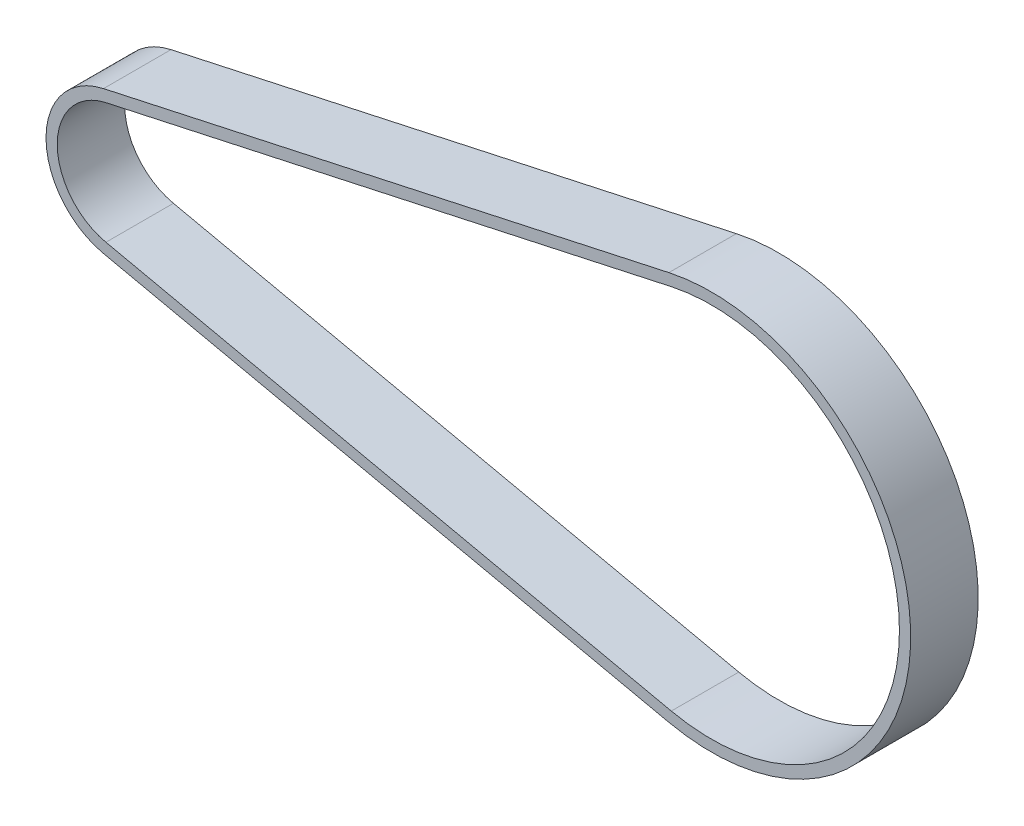
ISO-10303-21;
HEADER;
FILE_DESCRIPTION(('STEP AP214'),'2;1');
FILE_NAME('part.step','',(''),(''),'','','');
FILE_SCHEMA(('AUTOMOTIVE_DESIGN { 1 0 10303 214 1 1 1 1 }'));
ENDSEC;
DATA;
#1=APPLICATION_CONTEXT('core data for automotive mechanical design processes');
#2=APPLICATION_PROTOCOL_DEFINITION('international standard','automotive_design',2000,#1);
#3=PRODUCT_CONTEXT('',#1,'mechanical');
#4=PRODUCT('Part','Part','',(#3));
#5=PRODUCT_RELATED_PRODUCT_CATEGORY('part','',(#4));
#6=PRODUCT_DEFINITION_FORMATION('','',#4);
#7=PRODUCT_DEFINITION_CONTEXT('part definition',#1,'design');
#8=PRODUCT_DEFINITION('design','',#6,#7);
#9=PRODUCT_DEFINITION_SHAPE('','',#8);
#10=(LENGTH_UNIT() NAMED_UNIT(*) SI_UNIT(.MILLI.,.METRE.));
#11=(NAMED_UNIT(*) PLANE_ANGLE_UNIT() SI_UNIT($,.RADIAN.));
#12=(NAMED_UNIT(*) SI_UNIT($,.STERADIAN.) SOLID_ANGLE_UNIT());
#13=UNCERTAINTY_MEASURE_WITH_UNIT(LENGTH_MEASURE(1.E-05),#10,'distance_accuracy_value','');
#14=(GEOMETRIC_REPRESENTATION_CONTEXT(3) GLOBAL_UNCERTAINTY_ASSIGNED_CONTEXT((#13)) GLOBAL_UNIT_ASSIGNED_CONTEXT((#10,
#11,#12)) REPRESENTATION_CONTEXT('',''));
#15=CARTESIAN_POINT('',(0.,0.,0.));
#16=DIRECTION('',(0.,0.,1.));
#17=DIRECTION('',(1.,0.,0.));
#18=AXIS2_PLACEMENT_3D('',#15,#16,#17);
#19=CARTESIAN_POINT('',(0.,0.,6.));
#20=DIRECTION('',(0.,0.,1.));
#21=DIRECTION('',(1.,0.,0.));
#22=AXIS2_PLACEMENT_3D('',#19,#20,#21);
#23=PLANE('',#22);
#24=CARTESIAN_POINT('',(0.,0.,6.));
#25=DIRECTION('',(0.,0.,1.));
#26=DIRECTION('',(1.,0.,0.));
#27=AXIS2_PLACEMENT_3D('',#24,#25,#26);
#28=CIRCLE('',#27,6.5);
#29=CARTESIAN_POINT('',(-1.38518518518518,6.35068988400028,6.));
#30=VERTEX_POINT('',#29);
#31=CARTESIAN_POINT('',(-1.38518518518519,-6.35068988400028,6.));
#32=VERTEX_POINT('',#31);
#33=EDGE_CURVE('E153',#30,#32,#28,.T.);
#34=ORIENTED_EDGE('',*,*,#33,.T.);
#35=DIRECTION('',(0.97702921292312,-0.213105413105413,0.));
#36=VECTOR('',#35,1.);
#37=CARTESIAN_POINT('',(-1.38518518518519,-6.35068988400028,6.));
#38=LINE('',#37,#36);
#39=CARTESIAN_POINT('',(48.8737720797721,-17.3129576529977,6.));
#40=VERTEX_POINT('',#39);
#41=EDGE_CURVE('E157',#32,#40,#38,.T.);
#42=ORIENTED_EDGE('',*,*,#41,.T.);
#43=CARTESIAN_POINT('',(52.65,0.,6.));
#44=DIRECTION('',(0.,0.,1.));
#45=DIRECTION('',(1.,0.,0.));
#46=AXIS2_PLACEMENT_3D('',#43,#44,#45);
#47=CIRCLE('',#46,17.72);
#48=CARTESIAN_POINT('',(48.8737720797721,17.3129576529977,6.));
#49=VERTEX_POINT('',#48);
#50=EDGE_CURVE('E161',#40,#49,#47,.T.);
#51=ORIENTED_EDGE('',*,*,#50,.T.);
#52=DIRECTION('',(-0.97702921292312,-0.213105413105413,0.));
#53=VECTOR('',#52,1.);
#54=CARTESIAN_POINT('',(-1.38518518518518,6.35068988400028,6.));
#55=LINE('',#54,#53);
#56=EDGE_CURVE('E164',#49,#30,#55,.T.);
#57=ORIENTED_EDGE('',*,*,#56,.T.);
#58=EDGE_LOOP('',(#34,#42,#51,#57));
#59=FACE_BOUND('',#58,.T.);
#60=DIRECTION('',(0.97702921292312,-0.213105413105413,0.));
#61=VECTOR('',#60,1.);
#62=CARTESIAN_POINT('',(-1.17207977207977,-5.37366067107716,6.));
#63=LINE('',#62,#61);
#64=CARTESIAN_POINT('',(-1.17207977207977,-5.37366067107716,6.));
#65=VERTEX_POINT('',#64);
#66=CARTESIAN_POINT('',(49.0868774928775,-16.3359284400746,6.));
#67=VERTEX_POINT('',#66);
#68=EDGE_CURVE('E114',#65,#67,#63,.T.);
#69=ORIENTED_EDGE('',*,*,#68,.F.);
#70=CARTESIAN_POINT('',(0.,0.,6.));
#71=DIRECTION('',(0.,0.,1.));
#72=DIRECTION('',(1.,0.,0.));
#73=AXIS2_PLACEMENT_3D('',#70,#71,#72);
#74=CIRCLE('',#73,5.5);
#75=CARTESIAN_POINT('',(-1.17207977207977,5.37366067107716,6.));
#76=VERTEX_POINT('',#75);
#77=EDGE_CURVE('E105',#76,#65,#74,.T.);
#78=ORIENTED_EDGE('',*,*,#77,.F.);
#79=DIRECTION('',(-0.97702921292312,-0.213105413105413,0.));
#80=VECTOR('',#79,1.);
#81=CARTESIAN_POINT('',(-1.17207977207977,5.37366067107716,6.));
#82=LINE('',#81,#80);
#83=CARTESIAN_POINT('',(49.0868774928775,16.3359284400746,6.));
#84=VERTEX_POINT('',#83);
#85=EDGE_CURVE('E131',#84,#76,#82,.T.);
#86=ORIENTED_EDGE('',*,*,#85,.F.);
#87=CARTESIAN_POINT('',(52.65,0.,6.));
#88=DIRECTION('',(0.,0.,1.));
#89=DIRECTION('',(1.,0.,0.));
#90=AXIS2_PLACEMENT_3D('',#87,#88,#89);
#91=CIRCLE('',#90,16.72);
#92=EDGE_CURVE('E127',#67,#84,#91,.T.);
#93=ORIENTED_EDGE('',*,*,#92,.F.);
#94=EDGE_LOOP('',(#69,#78,#86,#93));
#95=FACE_BOUND('',#94,.T.);
#96=ADVANCED_FACE('F39',(#59,#95),#23,.T.);
#97=CARTESIAN_POINT('',(0.,0.,0.));
#98=DIRECTION('',(0.,0.,1.));
#99=DIRECTION('',(1.,0.,0.));
#100=AXIS2_PLACEMENT_3D('',#97,#98,#99);
#101=PLANE('',#100);
#102=CARTESIAN_POINT('',(0.,0.,0.));
#103=DIRECTION('',(0.,0.,1.));
#104=DIRECTION('',(1.,0.,0.));
#105=AXIS2_PLACEMENT_3D('',#102,#103,#104);
#106=CIRCLE('',#105,6.5);
#107=CARTESIAN_POINT('',(-1.38518518518518,6.35068988400028,0.));
#108=VERTEX_POINT('',#107);
#109=CARTESIAN_POINT('',(-1.38518518518519,-6.35068988400028,0.));
#110=VERTEX_POINT('',#109);
#111=EDGE_CURVE('E123',#108,#110,#106,.T.);
#112=ORIENTED_EDGE('',*,*,#111,.F.);
#113=DIRECTION('',(-0.97702921292312,-0.213105413105413,0.));
#114=VECTOR('',#113,1.);
#115=CARTESIAN_POINT('',(-1.38518518518518,6.35068988400028,0.));
#116=LINE('',#115,#114);
#117=CARTESIAN_POINT('',(48.8737720797721,17.3129576529977,0.));
#118=VERTEX_POINT('',#117);
#119=EDGE_CURVE('E158',#118,#108,#116,.T.);
#120=ORIENTED_EDGE('',*,*,#119,.F.);
#121=CARTESIAN_POINT('',(52.65,0.,0.));
#122=DIRECTION('',(0.,0.,1.));
#123=DIRECTION('',(1.,0.,0.));
#124=AXIS2_PLACEMENT_3D('',#121,#122,#123);
#125=CIRCLE('',#124,17.72);
#126=CARTESIAN_POINT('',(48.8737720797721,-17.3129576529977,0.));
#127=VERTEX_POINT('',#126);
#128=EDGE_CURVE('E174',#127,#118,#125,.T.);
#129=ORIENTED_EDGE('',*,*,#128,.F.);
#130=DIRECTION('',(0.97702921292312,-0.213105413105413,0.));
#131=VECTOR('',#130,1.);
#132=CARTESIAN_POINT('',(-1.38518518518519,-6.35068988400028,0.));
#133=LINE('',#132,#131);
#134=EDGE_CURVE('E171',#110,#127,#133,.T.);
#135=ORIENTED_EDGE('',*,*,#134,.F.);
#136=EDGE_LOOP('',(#112,#120,#129,#135));
#137=FACE_BOUND('',#136,.T.);
#138=CARTESIAN_POINT('',(0.,0.,0.));
#139=DIRECTION('',(0.,0.,1.));
#140=DIRECTION('',(1.,0.,0.));
#141=AXIS2_PLACEMENT_3D('',#138,#139,#140);
#142=CIRCLE('',#141,5.5);
#143=CARTESIAN_POINT('',(-1.17207977207977,5.37366067107716,0.));
#144=VERTEX_POINT('',#143);
#145=CARTESIAN_POINT('',(-1.17207977207977,-5.37366067107716,0.));
#146=VERTEX_POINT('',#145);
#147=EDGE_CURVE('E63',#144,#146,#142,.T.);
#148=ORIENTED_EDGE('',*,*,#147,.T.);
#149=DIRECTION('',(0.97702921292312,-0.213105413105413,0.));
#150=VECTOR('',#149,1.);
#151=CARTESIAN_POINT('',(-1.17207977207977,-5.37366067107716,0.));
#152=LINE('',#151,#150);
#153=CARTESIAN_POINT('',(49.0868774928775,-16.3359284400746,0.));
#154=VERTEX_POINT('',#153);
#155=EDGE_CURVE('E121',#146,#154,#152,.T.);
#156=ORIENTED_EDGE('',*,*,#155,.T.);
#157=CARTESIAN_POINT('',(52.65,0.,0.));
#158=DIRECTION('',(0.,0.,1.));
#159=DIRECTION('',(1.,0.,0.));
#160=AXIS2_PLACEMENT_3D('',#157,#158,#159);
#161=CIRCLE('',#160,16.72);
#162=CARTESIAN_POINT('',(49.0868774928775,16.3359284400746,0.));
#163=VERTEX_POINT('',#162);
#164=EDGE_CURVE('E140',#154,#163,#161,.T.);
#165=ORIENTED_EDGE('',*,*,#164,.T.);
#166=DIRECTION('',(-0.97702921292312,-0.213105413105413,0.));
#167=VECTOR('',#166,1.);
#168=CARTESIAN_POINT('',(-1.17207977207977,5.37366067107716,0.));
#169=LINE('',#168,#167);
#170=EDGE_CURVE('E115',#163,#144,#169,.T.);
#171=ORIENTED_EDGE('',*,*,#170,.T.);
#172=EDGE_LOOP('',(#148,#156,#165,#171));
#173=FACE_BOUND('',#172,.T.);
#174=ADVANCED_FACE('F197',(#137,#173),#101,.F.);
#175=CARTESIAN_POINT('',(0.,0.,6.));
#176=DIRECTION('',(0.,0.,-1.));
#177=DIRECTION('',(-1.,0.,0.));
#178=AXIS2_PLACEMENT_3D('',#175,#176,#177);
#179=CYLINDRICAL_SURFACE('',#178,6.5);
#180=ORIENTED_EDGE('',*,*,#111,.T.);
#181=DIRECTION('',(0.,0.,-1.));
#182=VECTOR('',#181,1.);
#183=CARTESIAN_POINT('',(-1.38518518518519,-6.35068988400028,6.));
#184=LINE('',#183,#182);
#185=EDGE_CURVE('E11',#32,#110,#184,.T.);
#186=ORIENTED_EDGE('',*,*,#185,.F.);
#187=ORIENTED_EDGE('',*,*,#33,.F.);
#188=DIRECTION('',(0.,0.,-1.));
#189=VECTOR('',#188,1.);
#190=CARTESIAN_POINT('',(-1.38518518518518,6.35068988400028,6.));
#191=LINE('',#190,#189);
#192=EDGE_CURVE('E167',#30,#108,#191,.T.);
#193=ORIENTED_EDGE('',*,*,#192,.T.);
#194=EDGE_LOOP('',(#180,#186,#187,#193));
#195=FACE_BOUND('',#194,.T.);
#196=ADVANCED_FACE('F41',(#195),#179,.T.);
#197=CARTESIAN_POINT('',(-1.38518518518519,-6.35068988400028,6.));
#198=DIRECTION('',(0.213105413105413,0.97702921292312,0.));
#199=DIRECTION('',(-0.97702921292312,0.213105413105413,0.));
#200=AXIS2_PLACEMENT_3D('',#197,#198,#199);
#201=PLANE('',#200);
#202=ORIENTED_EDGE('',*,*,#134,.T.);
#203=DIRECTION('',(0.,0.,-1.));
#204=VECTOR('',#203,1.);
#205=CARTESIAN_POINT('',(48.8737720797721,-17.3129576529977,6.));
#206=LINE('',#205,#204);
#207=EDGE_CURVE('E48',#40,#127,#206,.T.);
#208=ORIENTED_EDGE('',*,*,#207,.F.);
#209=ORIENTED_EDGE('',*,*,#41,.F.);
#210=ORIENTED_EDGE('',*,*,#185,.T.);
#211=EDGE_LOOP('',(#202,#208,#209,#210));
#212=FACE_BOUND('',#211,.T.);
#213=ADVANCED_FACE('F207',(#212),#201,.F.);
#214=CARTESIAN_POINT('',(52.65,0.,6.));
#215=DIRECTION('',(0.,0.,-1.));
#216=DIRECTION('',(-1.,0.,0.));
#217=AXIS2_PLACEMENT_3D('',#214,#215,#216);
#218=CYLINDRICAL_SURFACE('',#217,17.72);
#219=ORIENTED_EDGE('',*,*,#128,.T.);
#220=DIRECTION('',(0.,0.,-1.));
#221=VECTOR('',#220,1.);
#222=CARTESIAN_POINT('',(48.8737720797721,17.3129576529977,6.));
#223=LINE('',#222,#221);
#224=EDGE_CURVE('E182',#49,#118,#223,.T.);
#225=ORIENTED_EDGE('',*,*,#224,.F.);
#226=ORIENTED_EDGE('',*,*,#50,.F.);
#227=ORIENTED_EDGE('',*,*,#207,.T.);
#228=EDGE_LOOP('',(#219,#225,#226,#227));
#229=FACE_BOUND('',#228,.T.);
#230=ADVANCED_FACE('F191',(#229),#218,.T.);
#231=CARTESIAN_POINT('',(-1.38518518518518,6.35068988400028,6.));
#232=DIRECTION('',(0.213105413105413,-0.97702921292312,0.));
#233=DIRECTION('',(0.97702921292312,0.213105413105413,0.));
#234=AXIS2_PLACEMENT_3D('',#231,#232,#233);
#235=PLANE('',#234);
#236=ORIENTED_EDGE('',*,*,#119,.T.);
#237=ORIENTED_EDGE('',*,*,#192,.F.);
#238=ORIENTED_EDGE('',*,*,#56,.F.);
#239=ORIENTED_EDGE('',*,*,#224,.T.);
#240=EDGE_LOOP('',(#236,#237,#238,#239));
#241=FACE_BOUND('',#240,.T.);
#242=ADVANCED_FACE('F201',(#241),#235,.F.);
#243=CARTESIAN_POINT('',(0.,0.,6.));
#244=DIRECTION('',(0.,0.,-1.));
#245=DIRECTION('',(-1.,0.,0.));
#246=AXIS2_PLACEMENT_3D('',#243,#244,#245);
#247=CYLINDRICAL_SURFACE('',#246,5.5);
#248=ORIENTED_EDGE('',*,*,#147,.F.);
#249=DIRECTION('',(0.,0.,-1.));
#250=VECTOR('',#249,1.);
#251=CARTESIAN_POINT('',(-1.17207977207977,5.37366067107716,6.));
#252=LINE('',#251,#250);
#253=EDGE_CURVE('E109',#76,#144,#252,.T.);
#254=ORIENTED_EDGE('',*,*,#253,.F.);
#255=ORIENTED_EDGE('',*,*,#77,.T.);
#256=DIRECTION('',(0.,0.,-1.));
#257=VECTOR('',#256,1.);
#258=CARTESIAN_POINT('',(-1.17207977207977,-5.37366067107716,6.));
#259=LINE('',#258,#257);
#260=EDGE_CURVE('E108',#65,#146,#259,.T.);
#261=ORIENTED_EDGE('',*,*,#260,.T.);
#262=EDGE_LOOP('',(#248,#254,#255,#261));
#263=FACE_BOUND('',#262,.T.);
#264=ADVANCED_FACE('F107',(#263),#247,.F.);
#265=CARTESIAN_POINT('',(-1.17207977207977,-5.37366067107716,6.));
#266=DIRECTION('',(0.213105413105413,0.97702921292312,0.));
#267=DIRECTION('',(-0.97702921292312,0.213105413105413,0.));
#268=AXIS2_PLACEMENT_3D('',#265,#266,#267);
#269=PLANE('',#268);
#270=ORIENTED_EDGE('',*,*,#155,.F.);
#271=ORIENTED_EDGE('',*,*,#260,.F.);
#272=ORIENTED_EDGE('',*,*,#68,.T.);
#273=DIRECTION('',(0.,0.,-1.));
#274=VECTOR('',#273,1.);
#275=CARTESIAN_POINT('',(49.0868774928775,-16.3359284400746,6.));
#276=LINE('',#275,#274);
#277=EDGE_CURVE('E124',#67,#154,#276,.T.);
#278=ORIENTED_EDGE('',*,*,#277,.T.);
#279=EDGE_LOOP('',(#270,#271,#272,#278));
#280=FACE_BOUND('',#279,.T.);
#281=ADVANCED_FACE('F118',(#280),#269,.T.);
#282=CARTESIAN_POINT('',(52.65,0.,6.));
#283=DIRECTION('',(0.,0.,-1.));
#284=DIRECTION('',(-1.,0.,0.));
#285=AXIS2_PLACEMENT_3D('',#282,#283,#284);
#286=CYLINDRICAL_SURFACE('',#285,16.72);
#287=ORIENTED_EDGE('',*,*,#164,.F.);
#288=ORIENTED_EDGE('',*,*,#277,.F.);
#289=ORIENTED_EDGE('',*,*,#92,.T.);
#290=DIRECTION('',(0.,0.,-1.));
#291=VECTOR('',#290,1.);
#292=CARTESIAN_POINT('',(49.0868774928775,16.3359284400746,6.));
#293=LINE('',#292,#291);
#294=EDGE_CURVE('E55',#84,#163,#293,.T.);
#295=ORIENTED_EDGE('',*,*,#294,.T.);
#296=EDGE_LOOP('',(#287,#288,#289,#295));
#297=FACE_BOUND('',#296,.T.);
#298=ADVANCED_FACE('F230',(#297),#286,.F.);
#299=CARTESIAN_POINT('',(-1.17207977207977,5.37366067107716,6.));
#300=DIRECTION('',(0.213105413105413,-0.97702921292312,0.));
#301=DIRECTION('',(0.97702921292312,0.213105413105413,0.));
#302=AXIS2_PLACEMENT_3D('',#299,#300,#301);
#303=PLANE('',#302);
#304=ORIENTED_EDGE('',*,*,#170,.F.);
#305=ORIENTED_EDGE('',*,*,#294,.F.);
#306=ORIENTED_EDGE('',*,*,#85,.T.);
#307=ORIENTED_EDGE('',*,*,#253,.T.);
#308=EDGE_LOOP('',(#304,#305,#306,#307));
#309=FACE_BOUND('',#308,.T.);
#310=ADVANCED_FACE('F234',(#309),#303,.T.);
#311=CLOSED_SHELL('',(#96,#174,#196,#213,#230,#242,#264,#281,#298,#310));
#312=MANIFOLD_SOLID_BREP('B2',#311);
#313=ADVANCED_BREP_SHAPE_REPRESENTATION('',(#18,#312),#14);
#314=SHAPE_DEFINITION_REPRESENTATION(#9,#313);
ENDSEC;
END-ISO-10303-21;
